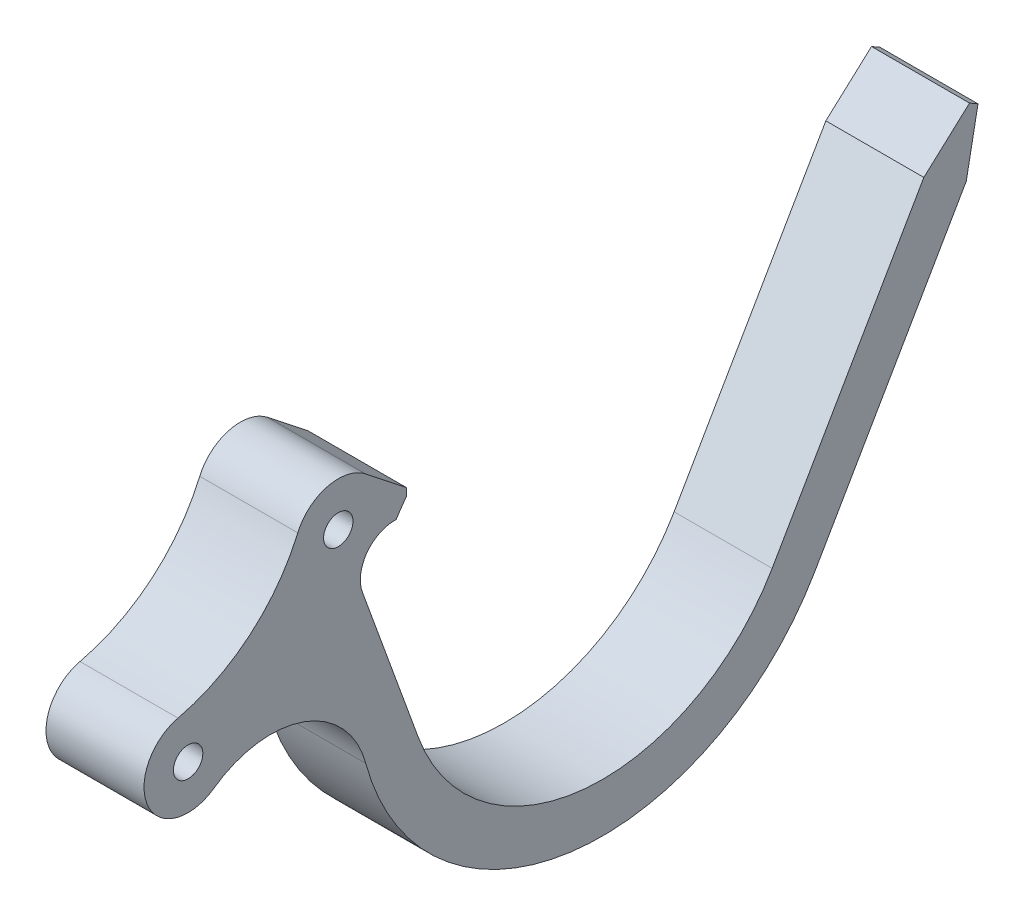
ISO-10303-21;
HEADER;
FILE_DESCRIPTION(('STEP AP214'),'2;1');
FILE_NAME('part.step','',(''),(''),'','','');
FILE_SCHEMA(('AUTOMOTIVE_DESIGN { 1 0 10303 214 1 1 1 1 }'));
ENDSEC;
DATA;
#1=APPLICATION_CONTEXT('core data for automotive mechanical design processes');
#2=APPLICATION_PROTOCOL_DEFINITION('international standard','automotive_design',2000,#1);
#3=PRODUCT_CONTEXT('',#1,'mechanical');
#4=PRODUCT('Part','Part','',(#3));
#5=PRODUCT_RELATED_PRODUCT_CATEGORY('part','',(#4));
#6=PRODUCT_DEFINITION_FORMATION('','',#4);
#7=PRODUCT_DEFINITION_CONTEXT('part definition',#1,'design');
#8=PRODUCT_DEFINITION('design','',#6,#7);
#9=PRODUCT_DEFINITION_SHAPE('','',#8);
#10=(LENGTH_UNIT() NAMED_UNIT(*) SI_UNIT(.MILLI.,.METRE.));
#11=(NAMED_UNIT(*) PLANE_ANGLE_UNIT() SI_UNIT($,.RADIAN.));
#12=(NAMED_UNIT(*) SI_UNIT($,.STERADIAN.) SOLID_ANGLE_UNIT());
#13=UNCERTAINTY_MEASURE_WITH_UNIT(LENGTH_MEASURE(1.E-05),#10,'distance_accuracy_value','');
#14=(GEOMETRIC_REPRESENTATION_CONTEXT(3) GLOBAL_UNCERTAINTY_ASSIGNED_CONTEXT((#13)) GLOBAL_UNIT_ASSIGNED_CONTEXT((#10,
#11,#12)) REPRESENTATION_CONTEXT('',''));
#15=CARTESIAN_POINT('',(0.,0.,0.));
#16=DIRECTION('',(0.,0.,1.));
#17=DIRECTION('',(1.,0.,0.));
#18=AXIS2_PLACEMENT_3D('',#15,#16,#17);
#19=CARTESIAN_POINT('',(10.,0.,20.));
#20=DIRECTION('',(0.,0.,1.));
#21=DIRECTION('',(1.,0.,0.));
#22=AXIS2_PLACEMENT_3D('',#19,#20,#21);
#23=PLANE('',#22);
#24=DIRECTION('',(0.,1.,0.));
#25=VECTOR('',#24,1.);
#26=CARTESIAN_POINT('',(0.,0.,20.));
#27=LINE('',#26,#25);
#28=CARTESIAN_POINT('',(0.,15.,20.));
#29=VERTEX_POINT('',#28);
#30=CARTESIAN_POINT('',(0.,15.8039443725317,20.));
#31=VERTEX_POINT('',#30);
#32=EDGE_CURVE('E195',#29,#31,#27,.T.);
#33=ORIENTED_EDGE('',*,*,#32,.T.);
#34=DIRECTION('',(-1.,0.,0.));
#35=VECTOR('',#34,1.);
#36=CARTESIAN_POINT('',(10.,15.8039443725317,20.));
#37=LINE('',#36,#35);
#38=CARTESIAN_POINT('',(10.,15.8039443725317,20.));
#39=VERTEX_POINT('',#38);
#40=EDGE_CURVE('E11',#39,#31,#37,.T.);
#41=ORIENTED_EDGE('',*,*,#40,.F.);
#42=DIRECTION('',(0.,1.,0.));
#43=VECTOR('',#42,1.);
#44=CARTESIAN_POINT('',(10.,0.,20.));
#45=LINE('',#44,#43);
#46=CARTESIAN_POINT('',(10.,15.,20.));
#47=VERTEX_POINT('',#46);
#48=EDGE_CURVE('E118',#47,#39,#45,.T.);
#49=ORIENTED_EDGE('',*,*,#48,.F.);
#50=DIRECTION('',(-1.,0.,0.));
#51=VECTOR('',#50,1.);
#52=CARTESIAN_POINT('',(10.,15.,20.));
#53=LINE('',#52,#51);
#54=EDGE_CURVE('E53',#47,#29,#53,.T.);
#55=ORIENTED_EDGE('',*,*,#54,.T.);
#56=EDGE_LOOP('',(#33,#41,#49,#55));
#57=FACE_BOUND('',#56,.T.);
#58=ADVANCED_FACE('F37',(#57),#23,.F.);
#59=CARTESIAN_POINT('',(10.,0.,0.));
#60=DIRECTION('',(0.,0.784606592716952,-0.619993947281016));
#61=DIRECTION('',(0.,0.619993947281016,0.784606592716952));
#62=AXIS2_PLACEMENT_3D('',#59,#60,#61);
#63=PLANE('',#62);
#64=DIRECTION('',(0.,-0.619993947281016,-0.784606592716952));
#65=VECTOR('',#64,1.);
#66=CARTESIAN_POINT('',(0.,0.,0.));
#67=LINE('',#66,#65);
#68=CARTESIAN_POINT('',(0.,19.0879679358304,24.1559543439125));
#69=VERTEX_POINT('',#68);
#70=EDGE_CURVE('E197',#69,#31,#67,.T.);
#71=ORIENTED_EDGE('',*,*,#70,.F.);
#72=DIRECTION('',(-1.,0.,0.));
#73=VECTOR('',#72,1.);
#74=CARTESIAN_POINT('',(10.,19.0879679358304,24.1559543439125));
#75=LINE('',#74,#73);
#76=CARTESIAN_POINT('',(10.,19.0879679358304,24.1559543439125));
#77=VERTEX_POINT('',#76);
#78=EDGE_CURVE('E45',#77,#69,#75,.T.);
#79=ORIENTED_EDGE('',*,*,#78,.F.);
#80=DIRECTION('',(0.,-0.619993947281016,-0.784606592716952));
#81=VECTOR('',#80,1.);
#82=CARTESIAN_POINT('',(10.,0.,0.));
#83=LINE('',#82,#81);
#84=EDGE_CURVE('E287',#77,#39,#83,.T.);
#85=ORIENTED_EDGE('',*,*,#84,.T.);
#86=ORIENTED_EDGE('',*,*,#40,.T.);
#87=EDGE_LOOP('',(#71,#79,#85,#86));
#88=FACE_BOUND('',#87,.T.);
#89=ADVANCED_FACE('F286',(#88),#63,.T.);
#90=CARTESIAN_POINT('',(10.,15.5572382686041,26.945927106677));
#91=DIRECTION('',(-1.,0.,0.));
#92=DIRECTION('',(0.,0.,1.));
#93=AXIS2_PLACEMENT_3D('',#90,#91,#92);
#94=CYLINDRICAL_SURFACE('',#93,4.5);
#95=CARTESIAN_POINT('',(0.,15.5572382686041,26.945927106677));
#96=DIRECTION('',(1.,0.,0.));
#97=DIRECTION('',(0.,0.,-1.));
#98=AXIS2_PLACEMENT_3D('',#95,#96,#97);
#99=CIRCLE('',#98,4.5);
#100=CARTESIAN_POINT('',(0.,17.3362989763332,31.0793207484942));
#101=VERTEX_POINT('',#100);
#102=EDGE_CURVE('E200',#69,#101,#99,.T.);
#103=ORIENTED_EDGE('',*,*,#102,.T.);
#104=DIRECTION('',(-1.,0.,0.));
#105=VECTOR('',#104,1.);
#106=CARTESIAN_POINT('',(10.,17.3362989763332,31.0793207484942));
#107=LINE('',#106,#105);
#108=CARTESIAN_POINT('',(10.,17.3362989763332,31.0793207484942));
#109=VERTEX_POINT('',#108);
#110=EDGE_CURVE('E271',#109,#101,#107,.T.);
#111=ORIENTED_EDGE('',*,*,#110,.F.);
#112=CARTESIAN_POINT('',(10.,15.5572382686041,26.945927106677));
#113=DIRECTION('',(1.,0.,0.));
#114=DIRECTION('',(0.,0.,-1.));
#115=AXIS2_PLACEMENT_3D('',#112,#113,#114);
#116=CIRCLE('',#115,4.5);
#117=EDGE_CURVE('E277',#77,#109,#116,.T.);
#118=ORIENTED_EDGE('',*,*,#117,.F.);
#119=ORIENTED_EDGE('',*,*,#78,.T.);
#120=EDGE_LOOP('',(#103,#111,#118,#119));
#121=FACE_BOUND('',#120,.T.);
#122=ADVANCED_FACE('F275',(#121),#94,.T.);
#123=CARTESIAN_POINT('',(10.,24.3522563900393,47.3798964618935));
#124=DIRECTION('',(-1.,0.,0.));
#125=DIRECTION('',(0.,0.,1.));
#126=AXIS2_PLACEMENT_3D('',#123,#124,#125);
#127=CYLINDRICAL_SURFACE('',#126,17.746335594122);
#128=CARTESIAN_POINT('',(0.,24.3522563900393,47.3798964618935));
#129=DIRECTION('',(1.,0.,0.));
#130=DIRECTION('',(0.,0.,-1.));
#131=AXIS2_PLACEMENT_3D('',#128,#129,#130);
#132=CIRCLE('',#131,17.746335594122);
#133=CARTESIAN_POINT('',(0.,7.08101482944225,43.301092473626));
#134=VERTEX_POINT('',#133);
#135=EDGE_CURVE('E203',#134,#101,#132,.T.);
#136=ORIENTED_EDGE('',*,*,#135,.F.);
#137=DIRECTION('',(-1.,0.,0.));
#138=VECTOR('',#137,1.);
#139=CARTESIAN_POINT('',(10.,7.08101482944225,43.301092473626));
#140=LINE('',#139,#138);
#141=CARTESIAN_POINT('',(10.,7.08101482944225,43.301092473626));
#142=VERTEX_POINT('',#141);
#143=EDGE_CURVE('E269',#142,#134,#140,.T.);
#144=ORIENTED_EDGE('',*,*,#143,.F.);
#145=CARTESIAN_POINT('',(10.,24.3522563900393,47.3798964618935));
#146=DIRECTION('',(1.,0.,0.));
#147=DIRECTION('',(0.,0.,-1.));
#148=AXIS2_PLACEMENT_3D('',#145,#146,#147);
#149=CIRCLE('',#148,17.746335594122);
#150=EDGE_CURVE('E652',#142,#109,#149,.T.);
#151=ORIENTED_EDGE('',*,*,#150,.T.);
#152=ORIENTED_EDGE('',*,*,#110,.T.);
#153=EDGE_LOOP('',(#136,#144,#151,#152));
#154=FACE_BOUND('',#153,.T.);
#155=ADVANCED_FACE('F309',(#154),#127,.F.);
#156=CARTESIAN_POINT('',(10.,2.70148607487335,42.2668159690567));
#157=DIRECTION('',(-1.,0.,0.));
#158=DIRECTION('',(0.,0.,1.));
#159=AXIS2_PLACEMENT_3D('',#156,#157,#158);
#160=CYLINDRICAL_SURFACE('',#159,4.5);
#161=CARTESIAN_POINT('',(0.,2.70148607487335,42.2668159690567));
#162=DIRECTION('',(1.,0.,0.));
#163=DIRECTION('',(0.,0.,-1.));
#164=AXIS2_PLACEMENT_3D('',#161,#162,#163);
#165=CIRCLE('',#164,4.5);
#166=CARTESIAN_POINT('',(0.,-0.95776493882692,39.6476783211402));
#167=VERTEX_POINT('',#166);
#168=EDGE_CURVE('E206',#134,#167,#165,.T.);
#169=ORIENTED_EDGE('',*,*,#168,.T.);
#170=DIRECTION('',(-1.,0.,0.));
#171=VECTOR('',#170,1.);
#172=CARTESIAN_POINT('',(10.,-0.95776493882692,39.6476783211402));
#173=LINE('',#172,#171);
#174=CARTESIAN_POINT('',(10.,-0.95776493882692,39.6476783211402));
#175=VERTEX_POINT('',#174);
#176=EDGE_CURVE('E267',#175,#167,#173,.T.);
#177=ORIENTED_EDGE('',*,*,#176,.F.);
#178=CARTESIAN_POINT('',(10.,2.70148607487335,42.2668159690567));
#179=DIRECTION('',(1.,0.,0.));
#180=DIRECTION('',(0.,0.,-1.));
#181=AXIS2_PLACEMENT_3D('',#178,#179,#180);
#182=CIRCLE('',#181,4.5);
#183=EDGE_CURVE('E653',#142,#175,#182,.T.);
#184=ORIENTED_EDGE('',*,*,#183,.F.);
#185=ORIENTED_EDGE('',*,*,#143,.T.);
#186=EDGE_LOOP('',(#169,#177,#184,#185));
#187=FACE_BOUND('',#186,.T.);
#188=ADVANCED_FACE('F314',(#187),#160,.T.);
#189=CARTESIAN_POINT('',(10.,-9.10584367995179,33.8156269780736));
#190=DIRECTION('',(-1.,0.,0.));
#191=DIRECTION('',(0.,0.,1.));
#192=AXIS2_PLACEMENT_3D('',#189,#190,#191);
#193=CYLINDRICAL_SURFACE('',#192,10.0201801400841);
#194=CARTESIAN_POINT('',(0.,-9.10584367995179,33.8156269780736));
#195=DIRECTION('',(1.,0.,0.));
#196=DIRECTION('',(0.,0.,-1.));
#197=AXIS2_PLACEMENT_3D('',#194,#195,#196);
#198=CIRCLE('',#197,10.0201801400841);
#199=CARTESIAN_POINT('',(0.,-6.50042607114494,24.1401006810986));
#200=VERTEX_POINT('',#199);
#201=EDGE_CURVE('E209',#200,#167,#198,.T.);
#202=ORIENTED_EDGE('',*,*,#201,.F.);
#203=DIRECTION('',(-1.,0.,0.));
#204=VECTOR('',#203,1.);
#205=CARTESIAN_POINT('',(10.,-6.50042607114494,24.1401006810986));
#206=LINE('',#205,#204);
#207=CARTESIAN_POINT('',(10.,-6.50042607114494,24.1401006810986));
#208=VERTEX_POINT('',#207);
#209=EDGE_CURVE('E265',#208,#200,#206,.T.);
#210=ORIENTED_EDGE('',*,*,#209,.F.);
#211=CARTESIAN_POINT('',(10.,-9.10584367995179,33.8156269780736));
#212=DIRECTION('',(1.,0.,0.));
#213=DIRECTION('',(0.,0.,-1.));
#214=AXIS2_PLACEMENT_3D('',#211,#212,#213);
#215=CIRCLE('',#214,10.0201801400841);
#216=EDGE_CURVE('E648',#208,#175,#215,.T.);
#217=ORIENTED_EDGE('',*,*,#216,.T.);
#218=ORIENTED_EDGE('',*,*,#176,.T.);
#219=EDGE_LOOP('',(#202,#210,#217,#218));
#220=FACE_BOUND('',#219,.T.);
#221=ADVANCED_FACE('F318',(#220),#193,.F.);
#222=CARTESIAN_POINT('',(10.,0.,0.));
#223=DIRECTION('',(-1.,0.,0.));
#224=DIRECTION('',(0.,0.,1.));
#225=AXIS2_PLACEMENT_3D('',#222,#223,#224);
#226=CYLINDRICAL_SURFACE('',#225,25.);
#227=CARTESIAN_POINT('',(0.,0.,0.));
#228=DIRECTION('',(1.,0.,0.));
#229=DIRECTION('',(0.,0.,-1.));
#230=AXIS2_PLACEMENT_3D('',#227,#228,#229);
#231=CIRCLE('',#230,25.);
#232=CARTESIAN_POINT('',(0.,-12.5,-21.6506350946109));
#233=VERTEX_POINT('',#232);
#234=EDGE_CURVE('E212',#200,#233,#231,.T.);
#235=ORIENTED_EDGE('',*,*,#234,.T.);
#236=DIRECTION('',(-1.,0.,0.));
#237=VECTOR('',#236,1.);
#238=CARTESIAN_POINT('',(10.,-12.5,-21.6506350946109));
#239=LINE('',#238,#237);
#240=CARTESIAN_POINT('',(10.,-12.5,-21.6506350946109));
#241=VERTEX_POINT('',#240);
#242=EDGE_CURVE('E262',#241,#233,#239,.T.);
#243=ORIENTED_EDGE('',*,*,#242,.F.);
#244=CARTESIAN_POINT('',(10.,0.,0.));
#245=DIRECTION('',(1.,0.,0.));
#246=DIRECTION('',(0.,0.,-1.));
#247=AXIS2_PLACEMENT_3D('',#244,#245,#246);
#248=CIRCLE('',#247,25.);
#249=EDGE_CURVE('E643',#208,#241,#248,.T.);
#250=ORIENTED_EDGE('',*,*,#249,.F.);
#251=ORIENTED_EDGE('',*,*,#209,.T.);
#252=EDGE_LOOP('',(#235,#243,#250,#251));
#253=FACE_BOUND('',#252,.T.);
#254=ADVANCED_FACE('F322',(#253),#226,.T.);
#255=CARTESIAN_POINT('',(10.,-12.5,-21.6506350946109));
#256=DIRECTION('',(0.,0.500000000000001,0.866025403784438));
#257=DIRECTION('',(0.,-0.866025403784438,0.500000000000001));
#258=AXIS2_PLACEMENT_3D('',#255,#256,#257);
#259=PLANE('',#258);
#260=DIRECTION('',(0.,0.866025403784438,-0.500000000000001));
#261=VECTOR('',#260,1.);
#262=CARTESIAN_POINT('',(0.,-12.5,-21.6506350946109));
#263=LINE('',#262,#261);
#264=CARTESIAN_POINT('',(0.,14.3072382686041,-37.12780132522));
#265=VERTEX_POINT('',#264);
#266=EDGE_CURVE('E214',#233,#265,#263,.T.);
#267=ORIENTED_EDGE('',*,*,#266,.T.);
#268=DIRECTION('',(-1.,0.,0.));
#269=VECTOR('',#268,1.);
#270=CARTESIAN_POINT('',(10.,14.3072382686041,-37.12780132522));
#271=LINE('',#270,#269);
#272=CARTESIAN_POINT('',(10.,14.3072382686041,-37.12780132522));
#273=VERTEX_POINT('',#272);
#274=EDGE_CURVE('E260',#273,#265,#271,.T.);
#275=ORIENTED_EDGE('',*,*,#274,.F.);
#276=DIRECTION('',(0.,0.866025403784438,-0.500000000000001));
#277=VECTOR('',#276,1.);
#278=CARTESIAN_POINT('',(10.,-12.5,-21.6506350946109));
#279=LINE('',#278,#277);
#280=EDGE_CURVE('E641',#241,#273,#279,.T.);
#281=ORIENTED_EDGE('',*,*,#280,.F.);
#282=ORIENTED_EDGE('',*,*,#242,.T.);
#283=EDGE_LOOP('',(#267,#275,#281,#282));
#284=FACE_BOUND('',#283,.T.);
#285=ADVANCED_FACE('F326',(#284),#259,.F.);
#286=CARTESIAN_POINT('',(10.,-6.35890648631708,-33.1654185933601));
#287=DIRECTION('',(0.,-0.188303118478278,-0.982110958889756));
#288=DIRECTION('',(0.,0.982110958889756,-0.188303118478278));
#289=AXIS2_PLACEMENT_3D('',#286,#287,#288);
#290=PLANE('',#289);
#291=DIRECTION('',(0.,-0.982110958889756,0.188303118478278));
#292=VECTOR('',#291,1.);
#293=CARTESIAN_POINT('',(0.,-6.35890648631708,-33.1654185933601));
#294=LINE('',#293,#292);
#295=CARTESIAN_POINT('',(0.,20.5443497207763,-38.3236616565906));
#296=VERTEX_POINT('',#295);
#297=EDGE_CURVE('E217',#296,#265,#294,.T.);
#298=ORIENTED_EDGE('',*,*,#297,.F.);
#299=DIRECTION('',(-1.,0.,0.));
#300=VECTOR('',#299,1.);
#301=CARTESIAN_POINT('',(10.,20.5443497207763,-38.3236616565906));
#302=LINE('',#301,#300);
#303=CARTESIAN_POINT('',(10.,20.5443497207763,-38.3236616565906));
#304=VERTEX_POINT('',#303);
#305=EDGE_CURVE('E258',#304,#296,#302,.T.);
#306=ORIENTED_EDGE('',*,*,#305,.F.);
#307=DIRECTION('',(0.,-0.982110958889756,0.188303118478278));
#308=VECTOR('',#307,1.);
#309=CARTESIAN_POINT('',(10.,-6.35890648631708,-33.1654185933601));
#310=LINE('',#309,#308);
#311=EDGE_CURVE('E638',#304,#273,#310,.T.);
#312=ORIENTED_EDGE('',*,*,#311,.T.);
#313=ORIENTED_EDGE('',*,*,#274,.T.);
#314=EDGE_LOOP('',(#298,#306,#312,#313));
#315=FACE_BOUND('',#314,.T.);
#316=ADVANCED_FACE('F330',(#315),#290,.T.);
#317=CARTESIAN_POINT('',(10.,32.0028945709058,-18.4768797953597));
#318=DIRECTION('',(0.,0.866025403784438,-0.500000000000001));
#319=DIRECTION('',(0.,0.500000000000001,0.866025403784438));
#320=AXIS2_PLACEMENT_3D('',#317,#318,#319);
#321=PLANE('',#320);
#322=DIRECTION('',(0.,-0.500000000000001,-0.866025403784438));
#323=VECTOR('',#322,1.);
#324=CARTESIAN_POINT('',(0.,32.0028945709058,-18.4768797953597));
#325=LINE('',#324,#323);
#326=CARTESIAN_POINT('',(0.,21.0443497207763,-37.4576362528062));
#327=VERTEX_POINT('',#326);
#328=EDGE_CURVE('E220',#327,#296,#325,.T.);
#329=ORIENTED_EDGE('',*,*,#328,.F.);
#330=DIRECTION('',(-1.,0.,0.));
#331=VECTOR('',#330,1.);
#332=CARTESIAN_POINT('',(10.,21.0443497207763,-37.4576362528062));
#333=LINE('',#332,#331);
#334=CARTESIAN_POINT('',(10.,21.0443497207763,-37.4576362528062));
#335=VERTEX_POINT('',#334);
#336=EDGE_CURVE('E256',#335,#327,#333,.T.);
#337=ORIENTED_EDGE('',*,*,#336,.F.);
#338=DIRECTION('',(0.,-0.500000000000001,-0.866025403784438));
#339=VECTOR('',#338,1.);
#340=CARTESIAN_POINT('',(10.,32.0028945709058,-18.4768797953597));
#341=LINE('',#340,#339);
#342=EDGE_CURVE('E663',#335,#304,#341,.T.);
#343=ORIENTED_EDGE('',*,*,#342,.T.);
#344=ORIENTED_EDGE('',*,*,#305,.T.);
#345=EDGE_LOOP('',(#329,#337,#343,#344));
#346=FACE_BOUND('',#345,.T.);
#347=ADVANCED_FACE('F334',(#346),#321,.T.);
#348=CARTESIAN_POINT('',(10.,-7.12430532464698,-6.47783737857594));
#349=DIRECTION('',(0.,0.739878238364894,0.67274080625012));
#350=DIRECTION('',(0.,-0.67274080625012,0.739878238364894));
#351=AXIS2_PLACEMENT_3D('',#348,#349,#350);
#352=PLANE('',#351);
#353=DIRECTION('',(0.,0.67274080625012,-0.739878238364894));
#354=VECTOR('',#353,1.);
#355=CARTESIAN_POINT('',(0.,-7.12430532464698,-6.47783737857594));
#356=LINE('',#355,#354);
#357=CARTESIAN_POINT('',(0.,16.8072382686041,-32.7976743062978));
#358=VERTEX_POINT('',#357);
#359=EDGE_CURVE('E223',#358,#327,#356,.T.);
#360=ORIENTED_EDGE('',*,*,#359,.F.);
#361=DIRECTION('',(-1.,0.,0.));
#362=VECTOR('',#361,1.);
#363=CARTESIAN_POINT('',(10.,16.8072382686041,-32.7976743062978));
#364=LINE('',#363,#362);
#365=CARTESIAN_POINT('',(10.,16.8072382686041,-32.7976743062978));
#366=VERTEX_POINT('',#365);
#367=EDGE_CURVE('E254',#366,#358,#364,.T.);
#368=ORIENTED_EDGE('',*,*,#367,.F.);
#369=DIRECTION('',(0.,0.67274080625012,-0.739878238364894));
#370=VECTOR('',#369,1.);
#371=CARTESIAN_POINT('',(10.,-7.12430532464698,-6.47783737857594));
#372=LINE('',#371,#370);
#373=EDGE_CURVE('E629',#366,#335,#372,.T.);
#374=ORIENTED_EDGE('',*,*,#373,.T.);
#375=ORIENTED_EDGE('',*,*,#336,.T.);
#376=EDGE_LOOP('',(#360,#368,#374,#375));
#377=FACE_BOUND('',#376,.T.);
#378=ADVANCED_FACE('F338',(#377),#352,.T.);
#379=CARTESIAN_POINT('',(10.,-10.,-17.3205080756888));
#380=DIRECTION('',(0.,-0.5,-0.866025403784439));
#381=DIRECTION('',(0.,0.866025403784439,-0.5));
#382=AXIS2_PLACEMENT_3D('',#379,#380,#381);
#383=PLANE('',#382);
#384=DIRECTION('',(0.,-0.866025403784439,0.5));
#385=VECTOR('',#384,1.);
#386=CARTESIAN_POINT('',(0.,-10.,-17.3205080756888));
#387=LINE('',#386,#385);
#388=CARTESIAN_POINT('',(0.,-10.,-17.3205080756888));
#389=VERTEX_POINT('',#388);
#390=EDGE_CURVE('E226',#358,#389,#387,.T.);
#391=ORIENTED_EDGE('',*,*,#390,.T.);
#392=DIRECTION('',(-1.,0.,0.));
#393=VECTOR('',#392,1.);
#394=CARTESIAN_POINT('',(10.,-10.,-17.3205080756888));
#395=LINE('',#394,#393);
#396=CARTESIAN_POINT('',(10.,-10.,-17.3205080756888));
#397=VERTEX_POINT('',#396);
#398=EDGE_CURVE('E252',#397,#389,#395,.T.);
#399=ORIENTED_EDGE('',*,*,#398,.F.);
#400=DIRECTION('',(0.,-0.866025403784439,0.5));
#401=VECTOR('',#400,1.);
#402=CARTESIAN_POINT('',(10.,-10.,-17.3205080756888));
#403=LINE('',#402,#401);
#404=EDGE_CURVE('E666',#366,#397,#403,.T.);
#405=ORIENTED_EDGE('',*,*,#404,.F.);
#406=ORIENTED_EDGE('',*,*,#367,.T.);
#407=EDGE_LOOP('',(#391,#399,#405,#406));
#408=FACE_BOUND('',#407,.T.);
#409=ADVANCED_FACE('F342',(#408),#383,.F.);
#410=CARTESIAN_POINT('',(10.,0.,0.));
#411=DIRECTION('',(-1.,0.,0.));
#412=DIRECTION('',(0.,0.,1.));
#413=AXIS2_PLACEMENT_3D('',#410,#411,#412);
#414=CYLINDRICAL_SURFACE('',#413,20.);
#415=CARTESIAN_POINT('',(0.,0.,0.));
#416=DIRECTION('',(1.,0.,0.));
#417=DIRECTION('',(0.,0.,-1.));
#418=AXIS2_PLACEMENT_3D('',#415,#416,#417);
#419=CIRCLE('',#418,20.);
#420=CARTESIAN_POINT('',(0.,-6.84040286651326,18.7938524157182));
#421=VERTEX_POINT('',#420);
#422=EDGE_CURVE('E229',#421,#389,#419,.T.);
#423=ORIENTED_EDGE('',*,*,#422,.F.);
#424=DIRECTION('',(-1.,0.,0.));
#425=VECTOR('',#424,1.);
#426=CARTESIAN_POINT('',(10.,-6.84040286651326,18.7938524157182));
#427=LINE('',#426,#425);
#428=CARTESIAN_POINT('',(10.,-6.84040286651326,18.7938524157182));
#429=VERTEX_POINT('',#428);
#430=EDGE_CURVE('E250',#429,#421,#427,.T.);
#431=ORIENTED_EDGE('',*,*,#430,.F.);
#432=CARTESIAN_POINT('',(10.,0.,0.));
#433=DIRECTION('',(1.,0.,0.));
#434=DIRECTION('',(0.,0.,-1.));
#435=AXIS2_PLACEMENT_3D('',#432,#433,#434);
#436=CIRCLE('',#435,20.);
#437=EDGE_CURVE('E184',#429,#397,#436,.T.);
#438=ORIENTED_EDGE('',*,*,#437,.T.);
#439=ORIENTED_EDGE('',*,*,#398,.T.);
#440=EDGE_LOOP('',(#423,#431,#438,#439));
#441=FACE_BOUND('',#440,.T.);
#442=ADVANCED_FACE('F346',(#441),#414,.F.);
#443=CARTESIAN_POINT('',(10.,-6.84040286651326,18.7938524157182));
#444=DIRECTION('',(0.,-0.342020143325663,0.93969262078591));
#445=DIRECTION('',(0.,-0.93969262078591,-0.342020143325663));
#446=AXIS2_PLACEMENT_3D('',#443,#444,#445);
#447=PLANE('',#446);
#448=DIRECTION('',(0.,0.939692620785911,0.342020143325663));
#449=VECTOR('',#448,1.);
#450=CARTESIAN_POINT('',(0.,-6.84040286651326,18.7938524157182));
#451=LINE('',#450,#449);
#452=CARTESIAN_POINT('',(0.,8.79732702911993,24.4855206292233));
#453=VERTEX_POINT('',#452);
#454=EDGE_CURVE('E232',#421,#453,#451,.T.);
#455=ORIENTED_EDGE('',*,*,#454,.T.);
#456=DIRECTION('',(-1.,0.,0.));
#457=VECTOR('',#456,1.);
#458=CARTESIAN_POINT('',(10.,8.79732702911993,24.4855206292233));
#459=LINE('',#458,#457);
#460=CARTESIAN_POINT('',(10.,8.79732702911993,24.4855206292233));
#461=VERTEX_POINT('',#460);
#462=EDGE_CURVE('E171',#461,#453,#459,.T.);
#463=ORIENTED_EDGE('',*,*,#462,.F.);
#464=DIRECTION('',(0.,0.939692620785911,0.342020143325663));
#465=VECTOR('',#464,1.);
#466=CARTESIAN_POINT('',(10.,-6.84040286651326,18.7938524157182));
#467=LINE('',#466,#465);
#468=EDGE_CURVE('E181',#429,#461,#467,.T.);
#469=ORIENTED_EDGE('',*,*,#468,.F.);
#470=ORIENTED_EDGE('',*,*,#430,.T.);
#471=EDGE_LOOP('',(#455,#463,#469,#470));
#472=FACE_BOUND('',#471,.T.);
#473=ADVANCED_FACE('F350',(#472),#447,.F.);
#474=CARTESIAN_POINT('',(10.,9.99439753075975,21.1965964564726));
#475=DIRECTION('',(-1.,0.,0.));
#476=DIRECTION('',(0.,0.,1.));
#477=AXIS2_PLACEMENT_3D('',#474,#475,#476);
#478=CYLINDRICAL_SURFACE('',#477,3.5);
#479=CARTESIAN_POINT('',(0.,9.99439753075975,21.1965964564726));
#480=DIRECTION('',(1.,0.,0.));
#481=DIRECTION('',(0.,0.,-1.));
#482=AXIS2_PLACEMENT_3D('',#479,#480,#481);
#483=CIRCLE('',#482,3.5);
#484=CARTESIAN_POINT('',(0.,13.4943975307597,21.1965964564726));
#485=VERTEX_POINT('',#484);
#486=EDGE_CURVE('E168',#485,#453,#483,.T.);
#487=ORIENTED_EDGE('',*,*,#486,.F.);
#488=DIRECTION('',(-1.,0.,0.));
#489=VECTOR('',#488,1.);
#490=CARTESIAN_POINT('',(10.,13.4943975307597,21.1965964564726));
#491=LINE('',#490,#489);
#492=CARTESIAN_POINT('',(10.,13.4943975307597,21.1965964564726));
#493=VERTEX_POINT('',#492);
#494=EDGE_CURVE('E162',#493,#485,#491,.T.);
#495=ORIENTED_EDGE('',*,*,#494,.F.);
#496=CARTESIAN_POINT('',(10.,9.99439753075975,21.1965964564726));
#497=DIRECTION('',(1.,0.,0.));
#498=DIRECTION('',(0.,0.,-1.));
#499=AXIS2_PLACEMENT_3D('',#496,#497,#498);
#500=CIRCLE('',#499,3.5);
#501=EDGE_CURVE('E166',#493,#461,#500,.T.);
#502=ORIENTED_EDGE('',*,*,#501,.T.);
#503=ORIENTED_EDGE('',*,*,#462,.T.);
#504=EDGE_LOOP('',(#487,#495,#502,#503));
#505=FACE_BOUND('',#504,.T.);
#506=ADVANCED_FACE('F164',(#505),#478,.F.);
#507=CARTESIAN_POINT('',(10.,13.4943975307597,0.));
#508=DIRECTION('',(0.,1.,0.));
#509=DIRECTION('',(0.,0.,1.));
#510=AXIS2_PLACEMENT_3D('',#507,#508,#509);
#511=PLANE('',#510);
#512=DIRECTION('',(0.,0.,-1.));
#513=VECTOR('',#512,1.);
#514=CARTESIAN_POINT('',(0.,13.4943975307597,0.));
#515=LINE('',#514,#513);
#516=CARTESIAN_POINT('',(0.,13.4943975307597,21.0452188223792));
#517=VERTEX_POINT('',#516);
#518=EDGE_CURVE('E236',#485,#517,#515,.T.);
#519=ORIENTED_EDGE('',*,*,#518,.T.);
#520=DIRECTION('',(-1.,0.,0.));
#521=VECTOR('',#520,1.);
#522=CARTESIAN_POINT('',(10.,13.4943975307597,21.0452188223792));
#523=LINE('',#522,#521);
#524=CARTESIAN_POINT('',(10.,13.4943975307597,21.0452188223792));
#525=VERTEX_POINT('',#524);
#526=EDGE_CURVE('E106',#525,#517,#523,.T.);
#527=ORIENTED_EDGE('',*,*,#526,.F.);
#528=DIRECTION('',(0.,0.,-1.));
#529=VECTOR('',#528,1.);
#530=CARTESIAN_POINT('',(10.,13.4943975307597,0.));
#531=LINE('',#530,#529);
#532=EDGE_CURVE('E173',#493,#525,#531,.T.);
#533=ORIENTED_EDGE('',*,*,#532,.F.);
#534=ORIENTED_EDGE('',*,*,#494,.T.);
#535=EDGE_LOOP('',(#519,#527,#533,#534));
#536=FACE_BOUND('',#535,.T.);
#537=ADVANCED_FACE('F174',(#536),#511,.F.);
#538=CARTESIAN_POINT('',(10.,15.5572382686041,26.945927106677));
#539=DIRECTION('',(-1.,0.,0.));
#540=DIRECTION('',(0.,0.,1.));
#541=AXIS2_PLACEMENT_3D('',#538,#539,#540);
#542=CYLINDRICAL_SURFACE('',#541,1.5);
#543=CARTESIAN_POINT('',(10.,15.5572382686041,26.945927106677));
#544=DIRECTION('',(1.,0.,0.));
#545=DIRECTION('',(0.,0.,-1.));
#546=AXIS2_PLACEMENT_3D('',#543,#544,#545);
#547=CIRCLE('',#546,1.5);
#548=CARTESIAN_POINT('',(10.,15.5572382686041,25.445927106677));
#549=VERTEX_POINT('',#548);
#550=EDGE_CURVE('E189',#549,#549,#547,.T.);
#551=ORIENTED_EDGE('',*,*,#550,.T.);
#552=EDGE_LOOP('',(#551));
#553=FACE_BOUND('',#552,.T.);
#554=CARTESIAN_POINT('',(0.,15.5572382686041,26.945927106677));
#555=DIRECTION('',(1.,0.,0.));
#556=DIRECTION('',(0.,0.,-1.));
#557=AXIS2_PLACEMENT_3D('',#554,#555,#556);
#558=CIRCLE('',#557,1.5);
#559=CARTESIAN_POINT('',(0.,15.5572382686041,25.445927106677));
#560=VERTEX_POINT('',#559);
#561=EDGE_CURVE('E241',#560,#560,#558,.T.);
#562=ORIENTED_EDGE('',*,*,#561,.F.);
#563=EDGE_LOOP('',(#562));
#564=FACE_BOUND('',#563,.T.);
#565=ADVANCED_FACE('F291',(#553,#564),#542,.F.);
#566=CARTESIAN_POINT('',(10.,0.,0.));
#567=DIRECTION('',(-1.,0.,0.));
#568=DIRECTION('',(0.,0.,1.));
#569=AXIS2_PLACEMENT_3D('',#566,#567,#568);
#570=CYLINDRICAL_SURFACE('',#569,25.);
#571=CARTESIAN_POINT('',(0.,0.,0.));
#572=DIRECTION('',(1.,0.,0.));
#573=DIRECTION('',(0.,0.,-1.));
#574=AXIS2_PLACEMENT_3D('',#571,#572,#573);
#575=CIRCLE('',#574,25.);
#576=EDGE_CURVE('E238',#29,#517,#575,.T.);
#577=ORIENTED_EDGE('',*,*,#576,.F.);
#578=ORIENTED_EDGE('',*,*,#54,.F.);
#579=CARTESIAN_POINT('',(10.,0.,0.));
#580=DIRECTION('',(1.,0.,0.));
#581=DIRECTION('',(0.,0.,-1.));
#582=AXIS2_PLACEMENT_3D('',#579,#580,#581);
#583=CIRCLE('',#582,25.);
#584=EDGE_CURVE('E175',#47,#525,#583,.T.);
#585=ORIENTED_EDGE('',*,*,#584,.T.);
#586=ORIENTED_EDGE('',*,*,#526,.T.);
#587=EDGE_LOOP('',(#577,#578,#585,#586));
#588=FACE_BOUND('',#587,.T.);
#589=ADVANCED_FACE('F288',(#588),#570,.F.);
#590=CARTESIAN_POINT('',(10.,2.70148607487335,42.2668159690567));
#591=DIRECTION('',(-1.,0.,0.));
#592=DIRECTION('',(0.,0.,1.));
#593=AXIS2_PLACEMENT_3D('',#590,#591,#592);
#594=CYLINDRICAL_SURFACE('',#593,1.50000000000001);
#595=CARTESIAN_POINT('',(10.,2.70148607487335,42.2668159690567));
#596=DIRECTION('',(1.,0.,0.));
#597=DIRECTION('',(0.,0.,-1.));
#598=AXIS2_PLACEMENT_3D('',#595,#596,#597);
#599=CIRCLE('',#598,1.50000000000001);
#600=CARTESIAN_POINT('',(10.,2.70148607487335,40.7668159690567));
#601=VERTEX_POINT('',#600);
#602=EDGE_CURVE('E192',#601,#601,#599,.T.);
#603=ORIENTED_EDGE('',*,*,#602,.T.);
#604=EDGE_LOOP('',(#603));
#605=FACE_BOUND('',#604,.T.);
#606=CARTESIAN_POINT('',(0.,2.70148607487335,42.2668159690567));
#607=DIRECTION('',(1.,0.,0.));
#608=DIRECTION('',(0.,0.,-1.));
#609=AXIS2_PLACEMENT_3D('',#606,#607,#608);
#610=CIRCLE('',#609,1.50000000000001);
#611=CARTESIAN_POINT('',(0.,2.70148607487335,40.7668159690567));
#612=VERTEX_POINT('',#611);
#613=EDGE_CURVE('E244',#612,#612,#610,.T.);
#614=ORIENTED_EDGE('',*,*,#613,.F.);
#615=EDGE_LOOP('',(#614));
#616=FACE_BOUND('',#615,.T.);
#617=ADVANCED_FACE('F290',(#605,#616),#594,.F.);
#618=CARTESIAN_POINT('',(10.,0.,0.));
#619=DIRECTION('',(1.,0.,0.));
#620=DIRECTION('',(0.,0.,-1.));
#621=AXIS2_PLACEMENT_3D('',#618,#619,#620);
#622=PLANE('',#621);
#623=ORIENTED_EDGE('',*,*,#48,.T.);
#624=ORIENTED_EDGE('',*,*,#84,.F.);
#625=ORIENTED_EDGE('',*,*,#117,.T.);
#626=ORIENTED_EDGE('',*,*,#150,.F.);
#627=ORIENTED_EDGE('',*,*,#183,.T.);
#628=ORIENTED_EDGE('',*,*,#216,.F.);
#629=ORIENTED_EDGE('',*,*,#249,.T.);
#630=ORIENTED_EDGE('',*,*,#280,.T.);
#631=ORIENTED_EDGE('',*,*,#311,.F.);
#632=ORIENTED_EDGE('',*,*,#342,.F.);
#633=ORIENTED_EDGE('',*,*,#373,.F.);
#634=ORIENTED_EDGE('',*,*,#404,.T.);
#635=ORIENTED_EDGE('',*,*,#437,.F.);
#636=ORIENTED_EDGE('',*,*,#468,.T.);
#637=ORIENTED_EDGE('',*,*,#501,.F.);
#638=ORIENTED_EDGE('',*,*,#532,.T.);
#639=ORIENTED_EDGE('',*,*,#584,.F.);
#640=EDGE_LOOP('',(#623,#624,#625,#626,#627,#628,#629,#630,#631,#632,#633,#634,#635,#636,#637,
#638,#639));
#641=FACE_BOUND('',#640,.T.);
#642=ORIENTED_EDGE('',*,*,#550,.F.);
#643=EDGE_LOOP('',(#642));
#644=FACE_BOUND('',#643,.T.);
#645=ORIENTED_EDGE('',*,*,#602,.F.);
#646=EDGE_LOOP('',(#645));
#647=FACE_BOUND('',#646,.T.);
#648=ADVANCED_FACE('F177',(#641,#644,#647),#622,.T.);
#649=CARTESIAN_POINT('',(0.,0.,0.));
#650=DIRECTION('',(1.,0.,0.));
#651=DIRECTION('',(0.,0.,-1.));
#652=AXIS2_PLACEMENT_3D('',#649,#650,#651);
#653=PLANE('',#652);
#654=ORIENTED_EDGE('',*,*,#32,.F.);
#655=ORIENTED_EDGE('',*,*,#576,.T.);
#656=ORIENTED_EDGE('',*,*,#518,.F.);
#657=ORIENTED_EDGE('',*,*,#486,.T.);
#658=ORIENTED_EDGE('',*,*,#454,.F.);
#659=ORIENTED_EDGE('',*,*,#422,.T.);
#660=ORIENTED_EDGE('',*,*,#390,.F.);
#661=ORIENTED_EDGE('',*,*,#359,.T.);
#662=ORIENTED_EDGE('',*,*,#328,.T.);
#663=ORIENTED_EDGE('',*,*,#297,.T.);
#664=ORIENTED_EDGE('',*,*,#266,.F.);
#665=ORIENTED_EDGE('',*,*,#234,.F.);
#666=ORIENTED_EDGE('',*,*,#201,.T.);
#667=ORIENTED_EDGE('',*,*,#168,.F.);
#668=ORIENTED_EDGE('',*,*,#135,.T.);
#669=ORIENTED_EDGE('',*,*,#102,.F.);
#670=ORIENTED_EDGE('',*,*,#70,.T.);
#671=EDGE_LOOP('',(#654,#655,#656,#657,#658,#659,#660,#661,#662,#663,#664,#665,#666,#667,#668,
#669,#670));
#672=FACE_BOUND('',#671,.T.);
#673=ORIENTED_EDGE('',*,*,#561,.T.);
#674=EDGE_LOOP('',(#673));
#675=FACE_BOUND('',#674,.T.);
#676=ORIENTED_EDGE('',*,*,#613,.T.);
#677=EDGE_LOOP('',(#676));
#678=FACE_BOUND('',#677,.T.);
#679=ADVANCED_FACE('F282',(#672,#675,#678),#653,.F.);
#680=CLOSED_SHELL('',(#58,#89,#122,#155,#188,#221,#254,#285,#316,#347,#378,#409,#442,#473,#506,
#537,#565,#589,#617,#648,#679));
#681=MANIFOLD_SOLID_BREP('B2',#680);
#682=ADVANCED_BREP_SHAPE_REPRESENTATION('',(#18,#681),#14);
#683=SHAPE_DEFINITION_REPRESENTATION(#9,#682);
ENDSEC;
END-ISO-10303-21;
